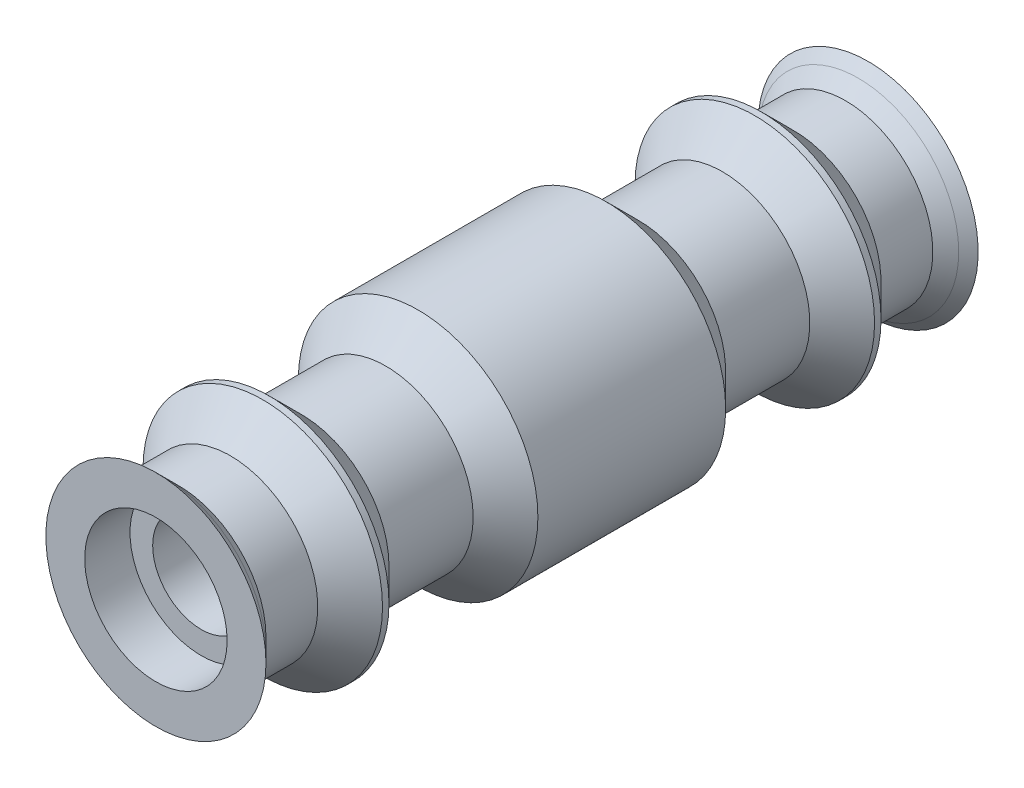
ISO-10303-21;
HEADER;
FILE_DESCRIPTION(('STEP AP214'),'2;1');
FILE_NAME('part.step','',(''),(''),'','','');
FILE_SCHEMA(('AUTOMOTIVE_DESIGN { 1 0 10303 214 1 1 1 1 }'));
ENDSEC;
DATA;
#1=APPLICATION_CONTEXT('core data for automotive mechanical design processes');
#2=APPLICATION_PROTOCOL_DEFINITION('international standard','automotive_design',2000,#1);
#3=PRODUCT_CONTEXT('',#1,'mechanical');
#4=PRODUCT('Part','Part','',(#3));
#5=PRODUCT_RELATED_PRODUCT_CATEGORY('part','',(#4));
#6=PRODUCT_DEFINITION_FORMATION('','',#4);
#7=PRODUCT_DEFINITION_CONTEXT('part definition',#1,'design');
#8=PRODUCT_DEFINITION('design','',#6,#7);
#9=PRODUCT_DEFINITION_SHAPE('','',#8);
#10=(LENGTH_UNIT() NAMED_UNIT(*) SI_UNIT(.MILLI.,.METRE.));
#11=(NAMED_UNIT(*) PLANE_ANGLE_UNIT() SI_UNIT($,.RADIAN.));
#12=(NAMED_UNIT(*) SI_UNIT($,.STERADIAN.) SOLID_ANGLE_UNIT());
#13=UNCERTAINTY_MEASURE_WITH_UNIT(LENGTH_MEASURE(1.E-05),#10,'distance_accuracy_value','');
#14=(GEOMETRIC_REPRESENTATION_CONTEXT(3) GLOBAL_UNCERTAINTY_ASSIGNED_CONTEXT((#13)) GLOBAL_UNIT_ASSIGNED_CONTEXT((#10,
#11,#12)) REPRESENTATION_CONTEXT('',''));
#15=CARTESIAN_POINT('',(0.,0.,0.));
#16=DIRECTION('',(0.,0.,1.));
#17=DIRECTION('',(1.,0.,0.));
#18=AXIS2_PLACEMENT_3D('',#15,#16,#17);
#19=CARTESIAN_POINT('',(0.,0.,107.));
#20=DIRECTION('',(0.,0.,-1.));
#21=DIRECTION('',(-1.,0.,0.));
#22=AXIS2_PLACEMENT_3D('',#19,#20,#21);
#23=CYLINDRICAL_SURFACE('',#22,18.5);
#24=CARTESIAN_POINT('',(0.,0.,90.9999999999999));
#25=DIRECTION('',(0.,0.,-1.));
#26=DIRECTION('',(-1.,0.,0.));
#27=AXIS2_PLACEMENT_3D('',#24,#25,#26);
#28=CIRCLE('',#27,18.5);
#29=CARTESIAN_POINT('',(-18.5,0.,91.));
#30=VERTEX_POINT('',#29);
#31=EDGE_CURVE('E51',#30,#30,#28,.F.);
#32=CARTESIAN_POINT('',(0.,0.,91.9999999999999));
#33=DIRECTION('',(0.,0.,-1.));
#34=DIRECTION('',(-1.,0.,0.));
#35=AXIS2_PLACEMENT_3D('',#32,#33,#34);
#36=CIRCLE('',#35,18.5);
#37=CARTESIAN_POINT('',(-18.5,0.,92.));
#38=VERTEX_POINT('',#37);
#39=EDGE_CURVE('E62',#38,#38,#36,.T.);
#40=CARTESIAN_POINT('',(-18.5,0.,91.));
#41=CARTESIAN_POINT('',(-18.5,0.,91.0104166666666));
#42=CARTESIAN_POINT('',(-18.5,0.,91.0208333333333));
#43=CARTESIAN_POINT('',(-18.5,0.,91.0416666666666));
#44=CARTESIAN_POINT('',(-18.5,0.,91.0520833333333));
#45=CARTESIAN_POINT('',(-18.5,0.,91.0729166666666));
#46=CARTESIAN_POINT('',(-18.5,0.,91.0833333333333));
#47=CARTESIAN_POINT('',(-18.5,0.,91.1041666666666));
#48=CARTESIAN_POINT('',(-18.5,0.,91.1145833333333));
#49=CARTESIAN_POINT('',(-18.5,0.,91.1354166666666));
#50=CARTESIAN_POINT('',(-18.5,0.,91.1458333333333));
#51=CARTESIAN_POINT('',(-18.5,0.,91.1666666666666));
#52=CARTESIAN_POINT('',(-18.5,0.,91.1770833333333));
#53=CARTESIAN_POINT('',(-18.5,0.,91.1979166666666));
#54=CARTESIAN_POINT('',(-18.5,0.,91.2083333333333));
#55=CARTESIAN_POINT('',(-18.5,0.,91.2291666666666));
#56=CARTESIAN_POINT('',(-18.5,0.,91.2395833333333));
#57=CARTESIAN_POINT('',(-18.5,0.,91.2604166666666));
#58=CARTESIAN_POINT('',(-18.5,0.,91.2708333333333));
#59=CARTESIAN_POINT('',(-18.5,0.,91.2916666666666));
#60=CARTESIAN_POINT('',(-18.5,0.,91.3020833333333));
#61=CARTESIAN_POINT('',(-18.5,0.,91.3229166666666));
#62=CARTESIAN_POINT('',(-18.5,0.,91.3333333333333));
#63=CARTESIAN_POINT('',(-18.5,0.,91.3541666666666));
#64=CARTESIAN_POINT('',(-18.5,0.,91.3645833333333));
#65=CARTESIAN_POINT('',(-18.5,0.,91.3854166666666));
#66=CARTESIAN_POINT('',(-18.5,0.,91.3958333333333));
#67=CARTESIAN_POINT('',(-18.5,0.,91.4166666666666));
#68=CARTESIAN_POINT('',(-18.5,0.,91.4270833333333));
#69=CARTESIAN_POINT('',(-18.5,0.,91.4479166666666));
#70=CARTESIAN_POINT('',(-18.5,0.,91.4583333333333));
#71=CARTESIAN_POINT('',(-18.5,0.,91.4791666666666));
#72=CARTESIAN_POINT('',(-18.5,0.,91.4895833333333));
#73=CARTESIAN_POINT('',(-18.5,0.,91.5104166666666));
#74=CARTESIAN_POINT('',(-18.5,0.,91.5208333333333));
#75=CARTESIAN_POINT('',(-18.5,0.,91.5416666666666));
#76=CARTESIAN_POINT('',(-18.5,0.,91.5520833333333));
#77=CARTESIAN_POINT('',(-18.5,0.,91.5729166666666));
#78=CARTESIAN_POINT('',(-18.5,0.,91.5833333333333));
#79=CARTESIAN_POINT('',(-18.5,0.,91.6041666666666));
#80=CARTESIAN_POINT('',(-18.5,0.,91.6145833333333));
#81=CARTESIAN_POINT('',(-18.5,0.,91.6354166666666));
#82=CARTESIAN_POINT('',(-18.5,0.,91.6458333333333));
#83=CARTESIAN_POINT('',(-18.5,0.,91.6666666666666));
#84=CARTESIAN_POINT('',(-18.5,0.,91.6770833333333));
#85=CARTESIAN_POINT('',(-18.5,0.,91.6979166666666));
#86=CARTESIAN_POINT('',(-18.5,0.,91.7083333333333));
#87=CARTESIAN_POINT('',(-18.5,0.,91.7291666666666));
#88=CARTESIAN_POINT('',(-18.5,0.,91.7395833333333));
#89=CARTESIAN_POINT('',(-18.5,0.,91.7604166666666));
#90=CARTESIAN_POINT('',(-18.5,0.,91.7708333333333));
#91=CARTESIAN_POINT('',(-18.5,0.,91.7916666666666));
#92=CARTESIAN_POINT('',(-18.5,0.,91.8020833333333));
#93=CARTESIAN_POINT('',(-18.5,0.,91.8229166666666));
#94=CARTESIAN_POINT('',(-18.5,0.,91.8333333333333));
#95=CARTESIAN_POINT('',(-18.5,0.,91.8541666666666));
#96=CARTESIAN_POINT('',(-18.5,0.,91.8645833333333));
#97=CARTESIAN_POINT('',(-18.5,0.,91.8854166666666));
#98=CARTESIAN_POINT('',(-18.5,0.,91.8958333333333));
#99=CARTESIAN_POINT('',(-18.5,0.,91.9166666666666));
#100=CARTESIAN_POINT('',(-18.5,0.,91.9270833333333));
#101=CARTESIAN_POINT('',(-18.5,0.,91.9479166666666));
#102=CARTESIAN_POINT('',(-18.5,0.,91.9583333333333));
#103=CARTESIAN_POINT('',(-18.5,0.,91.9791666666666));
#104=CARTESIAN_POINT('',(-18.5,0.,91.9895833333333));
#105=CARTESIAN_POINT('',(-18.5,0.,92.));
#106=B_SPLINE_CURVE_WITH_KNOTS('',3,(#40,#41,#42,#43,#44,#45,#46,#47,#48,#49,#50,#51,#52,#53,
#54,#55,#56,#57,#58,#59,#60,#61,#62,#63,#64,#65,#66,#67,#68,#69,#70,#71,#72,#73,#74,#75,#76,#77,
#78,#79,#80,#81,#82,#83,#84,#85,#86,#87,#88,#89,#90,#91,#92,#93,#94,#95,#96,#97,#98,#99,#100,
#101,#102,#103,#104,#105),.UNSPECIFIED.,.F.,.F.,(4,2,2,2,2,2,2,2,2,2,2,2,2,2,2,2,2,2,2,2,2,2,2,
2,2,2,2,2,2,2,2,2,4),(0.,0.0312499999999966,0.0624999999999931,0.0937499999999897,0.125,
0.156249999999997,0.187499999999993,0.218750000000004,0.25,0.281249999999997,0.312499999999993,
0.34374999999999,0.375,0.406249999999997,0.437499999999993,0.46874999999999,0.5,
0.531249999999997,0.562499999999994,0.59374999999999,0.625000000000001,0.656249999999997,
0.687499999999994,0.71874999999999,0.750000000000001,0.781249999999997,0.812499999999994,
0.84374999999999,0.875000000000001,0.906249999999997,0.937499999999994,0.96874999999999,1.),.UNSPECIFIED.);
#107=EDGE_CURVE('BSEAM35',#30,#38,#106,.T.);
#108=ORIENTED_EDGE('',*,*,#31,.T.);
#109=ORIENTED_EDGE('',*,*,#39,.T.);
#110=ORIENTED_EDGE('',*,*,#107,.T.);
#111=ORIENTED_EDGE('',*,*,#107,.F.);
#112=EDGE_LOOP('',(#108,#110,#109,#111));
#113=FACE_BOUND('',#112,.T.);
#114=ADVANCED_FACE('F35',(#113),#23,.T.);
#115=CARTESIAN_POINT('',(0.,0.,16.));
#116=DIRECTION('',(0.,0.,-1.));
#117=DIRECTION('',(-1.,0.,0.));
#118=AXIS2_PLACEMENT_3D('',#115,#116,#117);
#119=CIRCLE('',#118,18.5);
#120=CARTESIAN_POINT('',(-18.5,0.,16.));
#121=VERTEX_POINT('',#120);
#122=EDGE_CURVE('E47',#121,#121,#119,.T.);
#123=CARTESIAN_POINT('',(0.,0.,15.));
#124=DIRECTION('',(0.,0.,-1.));
#125=DIRECTION('',(-1.,0.,0.));
#126=AXIS2_PLACEMENT_3D('',#123,#124,#125);
#127=CIRCLE('',#126,18.5);
#128=CARTESIAN_POINT('',(-18.5,0.,15.));
#129=VERTEX_POINT('',#128);
#130=EDGE_CURVE('E68',#129,#129,#127,.F.);
#131=CARTESIAN_POINT('',(-18.5,0.,16.));
#132=CARTESIAN_POINT('',(-18.5,0.,15.9895833333333));
#133=CARTESIAN_POINT('',(-18.5,0.,15.9791666666666));
#134=CARTESIAN_POINT('',(-18.5,0.,15.9583333333333));
#135=CARTESIAN_POINT('',(-18.5,0.,15.9479166666666));
#136=CARTESIAN_POINT('',(-18.5,0.,15.9270833333333));
#137=CARTESIAN_POINT('',(-18.5,0.,15.9166666666666));
#138=CARTESIAN_POINT('',(-18.5,0.,15.8958333333333));
#139=CARTESIAN_POINT('',(-18.5,0.,15.8854166666666));
#140=CARTESIAN_POINT('',(-18.5,0.,15.8645833333333));
#141=CARTESIAN_POINT('',(-18.5,0.,15.8541666666666));
#142=CARTESIAN_POINT('',(-18.5,0.,15.8333333333333));
#143=CARTESIAN_POINT('',(-18.5,0.,15.8229166666666));
#144=CARTESIAN_POINT('',(-18.5,0.,15.8020833333333));
#145=CARTESIAN_POINT('',(-18.5,0.,15.7916666666666));
#146=CARTESIAN_POINT('',(-18.5,0.,15.7708333333333));
#147=CARTESIAN_POINT('',(-18.5,0.,15.7604166666666));
#148=CARTESIAN_POINT('',(-18.5,0.,15.7395833333333));
#149=CARTESIAN_POINT('',(-18.5,0.,15.7291666666666));
#150=CARTESIAN_POINT('',(-18.5,0.,15.7083333333333));
#151=CARTESIAN_POINT('',(-18.5,0.,15.6979166666666));
#152=CARTESIAN_POINT('',(-18.5,0.,15.6770833333333));
#153=CARTESIAN_POINT('',(-18.5,0.,15.6666666666666));
#154=CARTESIAN_POINT('',(-18.5,0.,15.6458333333333));
#155=CARTESIAN_POINT('',(-18.5,0.,15.6354166666667));
#156=CARTESIAN_POINT('',(-18.5,0.,15.6145833333333));
#157=CARTESIAN_POINT('',(-18.5,0.,15.6041666666667));
#158=CARTESIAN_POINT('',(-18.5,0.,15.5833333333333));
#159=CARTESIAN_POINT('',(-18.5,0.,15.5729166666667));
#160=CARTESIAN_POINT('',(-18.5,0.,15.5520833333333));
#161=CARTESIAN_POINT('',(-18.5,0.,15.5416666666666));
#162=CARTESIAN_POINT('',(-18.5,0.,15.5208333333333));
#163=CARTESIAN_POINT('',(-18.5,0.,15.5104166666667));
#164=CARTESIAN_POINT('',(-18.5,0.,15.4895833333333));
#165=CARTESIAN_POINT('',(-18.5,0.,15.4791666666667));
#166=CARTESIAN_POINT('',(-18.5,0.,15.4583333333333));
#167=CARTESIAN_POINT('',(-18.5,0.,15.4479166666667));
#168=CARTESIAN_POINT('',(-18.5,0.,15.4270833333333));
#169=CARTESIAN_POINT('',(-18.5,0.,15.4166666666667));
#170=CARTESIAN_POINT('',(-18.5,0.,15.3958333333333));
#171=CARTESIAN_POINT('',(-18.5,0.,15.3854166666667));
#172=CARTESIAN_POINT('',(-18.5,0.,15.3645833333333));
#173=CARTESIAN_POINT('',(-18.5,0.,15.3541666666667));
#174=CARTESIAN_POINT('',(-18.5,0.,15.3333333333333));
#175=CARTESIAN_POINT('',(-18.5,0.,15.3229166666667));
#176=CARTESIAN_POINT('',(-18.5,0.,15.3020833333333));
#177=CARTESIAN_POINT('',(-18.5,0.,15.2916666666667));
#178=CARTESIAN_POINT('',(-18.5,0.,15.2708333333333));
#179=CARTESIAN_POINT('',(-18.5,0.,15.2604166666667));
#180=CARTESIAN_POINT('',(-18.5,0.,15.2395833333333));
#181=CARTESIAN_POINT('',(-18.5,0.,15.2291666666667));
#182=CARTESIAN_POINT('',(-18.5,0.,15.2083333333333));
#183=CARTESIAN_POINT('',(-18.5,0.,15.1979166666667));
#184=CARTESIAN_POINT('',(-18.5,0.,15.1770833333333));
#185=CARTESIAN_POINT('',(-18.5,0.,15.1666666666667));
#186=CARTESIAN_POINT('',(-18.5,0.,15.1458333333333));
#187=CARTESIAN_POINT('',(-18.5,0.,15.1354166666667));
#188=CARTESIAN_POINT('',(-18.5,0.,15.1145833333333));
#189=CARTESIAN_POINT('',(-18.5,0.,15.1041666666667));
#190=CARTESIAN_POINT('',(-18.5,0.,15.0833333333333));
#191=CARTESIAN_POINT('',(-18.5,0.,15.0729166666667));
#192=CARTESIAN_POINT('',(-18.5,0.,15.0520833333333));
#193=CARTESIAN_POINT('',(-18.5,0.,15.0416666666667));
#194=CARTESIAN_POINT('',(-18.5,0.,15.0208333333333));
#195=CARTESIAN_POINT('',(-18.5,0.,15.0104166666667));
#196=CARTESIAN_POINT('',(-18.5,0.,15.));
#197=B_SPLINE_CURVE_WITH_KNOTS('',3,(#131,#132,#133,#134,#135,#136,#137,#138,#139,#140,#141,
#142,#143,#144,#145,#146,#147,#148,#149,#150,#151,#152,#153,#154,#155,#156,#157,#158,#159,#160,
#161,#162,#163,#164,#165,#166,#167,#168,#169,#170,#171,#172,#173,#174,#175,#176,#177,#178,#179,
#180,#181,#182,#183,#184,#185,#186,#187,#188,#189,#190,#191,#192,#193,#194,#195,#196),
.UNSPECIFIED.,.F.,.F.,(4,2,2,2,2,2,2,2,2,2,2,2,2,2,2,2,2,2,2,2,2,2,2,2,2,2,2,2,2,2,2,2,4),(0.,
0.0312499999999966,0.0624999999999931,0.0937500000000036,0.125,0.156249999999997,
0.187499999999993,0.21874999999999,0.25,0.281249999999997,0.312499999999993,0.34374999999999,
0.374999999999986,0.406249999999983,0.437499999999993,0.46874999999999,0.499999999999987,
0.531249999999983,0.56249999999998,0.59374999999999,0.624999999999987,0.656249999999983,
0.68749999999998,0.718749999999976,0.749999999999973,0.781249999999983,0.81249999999998,
0.843749999999976,0.874999999999973,0.90624999999997,0.93749999999998,0.968749999999977,
0.999999999999973),.UNSPECIFIED.);
#198=EDGE_CURVE('BSEAM132',#121,#129,#197,.T.);
#199=ORIENTED_EDGE('',*,*,#122,.T.);
#200=ORIENTED_EDGE('',*,*,#130,.T.);
#201=ORIENTED_EDGE('',*,*,#198,.T.);
#202=ORIENTED_EDGE('',*,*,#198,.F.);
#203=EDGE_LOOP('',(#199,#201,#200,#202));
#204=FACE_BOUND('',#203,.T.);
#205=ADVANCED_FACE('F132',(#204),#23,.T.);
#206=CARTESIAN_POINT('',(0.,0.,39.));
#207=DIRECTION('',(0.,0.,-1.));
#208=DIRECTION('',(-1.,0.,0.));
#209=AXIS2_PLACEMENT_3D('',#206,#207,#208);
#210=CIRCLE('',#209,18.5);
#211=CARTESIAN_POINT('',(-18.5,0.,39.));
#212=VERTEX_POINT('',#211);
#213=EDGE_CURVE('E56',#212,#212,#210,.F.);
#214=CARTESIAN_POINT('',(0.,0.,67.9999999999999));
#215=DIRECTION('',(0.,0.,-1.));
#216=DIRECTION('',(-1.,0.,0.));
#217=AXIS2_PLACEMENT_3D('',#214,#215,#216);
#218=CIRCLE('',#217,18.5);
#219=CARTESIAN_POINT('',(-18.5,0.,67.9999999999999));
#220=VERTEX_POINT('',#219);
#221=EDGE_CURVE('E59',#220,#220,#218,.T.);
#222=CARTESIAN_POINT('',(-18.5,0.,39.));
#223=CARTESIAN_POINT('',(-18.5,0.,39.3020833333333));
#224=CARTESIAN_POINT('',(-18.5,0.,39.6041666666667));
#225=CARTESIAN_POINT('',(-18.5,0.,40.2083333333333));
#226=CARTESIAN_POINT('',(-18.5,0.,40.5104166666667));
#227=CARTESIAN_POINT('',(-18.5,0.,41.1145833333333));
#228=CARTESIAN_POINT('',(-18.5,0.,41.4166666666667));
#229=CARTESIAN_POINT('',(-18.5,0.,42.0208333333333));
#230=CARTESIAN_POINT('',(-18.5,0.,42.3229166666667));
#231=CARTESIAN_POINT('',(-18.5,0.,42.9270833333333));
#232=CARTESIAN_POINT('',(-18.5,0.,43.2291666666666));
#233=CARTESIAN_POINT('',(-18.5,0.,43.8333333333333));
#234=CARTESIAN_POINT('',(-18.5,0.,44.1354166666667));
#235=CARTESIAN_POINT('',(-18.5,0.,44.7395833333333));
#236=CARTESIAN_POINT('',(-18.5,0.,45.0416666666666));
#237=CARTESIAN_POINT('',(-18.5,0.,45.6458333333333));
#238=CARTESIAN_POINT('',(-18.5,0.,45.9479166666666));
#239=CARTESIAN_POINT('',(-18.5,0.,46.5520833333333));
#240=CARTESIAN_POINT('',(-18.5,0.,46.8541666666666));
#241=CARTESIAN_POINT('',(-18.5,0.,47.4583333333333));
#242=CARTESIAN_POINT('',(-18.5,0.,47.7604166666666));
#243=CARTESIAN_POINT('',(-18.5,0.,48.3645833333333));
#244=CARTESIAN_POINT('',(-18.5,0.,48.6666666666666));
#245=CARTESIAN_POINT('',(-18.5,0.,49.2708333333333));
#246=CARTESIAN_POINT('',(-18.5,0.,49.5729166666666));
#247=CARTESIAN_POINT('',(-18.5,0.,50.1770833333333));
#248=CARTESIAN_POINT('',(-18.5,0.,50.4791666666666));
#249=CARTESIAN_POINT('',(-18.5,0.,51.0833333333333));
#250=CARTESIAN_POINT('',(-18.5,0.,51.3854166666666));
#251=CARTESIAN_POINT('',(-18.5,0.,51.9895833333333));
#252=CARTESIAN_POINT('',(-18.5,0.,52.2916666666666));
#253=CARTESIAN_POINT('',(-18.5,0.,52.8958333333333));
#254=CARTESIAN_POINT('',(-18.5,0.,53.1979166666666));
#255=CARTESIAN_POINT('',(-18.5,0.,53.8020833333333));
#256=CARTESIAN_POINT('',(-18.5,0.,54.1041666666666));
#257=CARTESIAN_POINT('',(-18.5,0.,54.7083333333333));
#258=CARTESIAN_POINT('',(-18.5,0.,55.0104166666666));
#259=CARTESIAN_POINT('',(-18.5,0.,55.6145833333333));
#260=CARTESIAN_POINT('',(-18.5,0.,55.9166666666666));
#261=CARTESIAN_POINT('',(-18.5,0.,56.5208333333333));
#262=CARTESIAN_POINT('',(-18.5,0.,56.8229166666666));
#263=CARTESIAN_POINT('',(-18.5,0.,57.4270833333333));
#264=CARTESIAN_POINT('',(-18.5,0.,57.7291666666666));
#265=CARTESIAN_POINT('',(-18.5,0.,58.3333333333333));
#266=CARTESIAN_POINT('',(-18.5,0.,58.6354166666666));
#267=CARTESIAN_POINT('',(-18.5,0.,59.2395833333333));
#268=CARTESIAN_POINT('',(-18.5,0.,59.5416666666666));
#269=CARTESIAN_POINT('',(-18.5,0.,60.1458333333333));
#270=CARTESIAN_POINT('',(-18.5,0.,60.4479166666666));
#271=CARTESIAN_POINT('',(-18.5,0.,61.0520833333333));
#272=CARTESIAN_POINT('',(-18.5,0.,61.3541666666666));
#273=CARTESIAN_POINT('',(-18.5,0.,61.9583333333333));
#274=CARTESIAN_POINT('',(-18.5,0.,62.2604166666666));
#275=CARTESIAN_POINT('',(-18.5,0.,62.8645833333333));
#276=CARTESIAN_POINT('',(-18.5,0.,63.1666666666666));
#277=CARTESIAN_POINT('',(-18.5,0.,63.7708333333333));
#278=CARTESIAN_POINT('',(-18.5,0.,64.0729166666666));
#279=CARTESIAN_POINT('',(-18.5,0.,64.6770833333333));
#280=CARTESIAN_POINT('',(-18.5,0.,64.9791666666666));
#281=CARTESIAN_POINT('',(-18.5,0.,65.5833333333333));
#282=CARTESIAN_POINT('',(-18.5,0.,65.8854166666666));
#283=CARTESIAN_POINT('',(-18.5,0.,66.4895833333333));
#284=CARTESIAN_POINT('',(-18.5,0.,66.7916666666666));
#285=CARTESIAN_POINT('',(-18.5,0.,67.3958333333333));
#286=CARTESIAN_POINT('',(-18.5,0.,67.6979166666666));
#287=CARTESIAN_POINT('',(-18.5,0.,67.9999999999999));
#288=B_SPLINE_CURVE_WITH_KNOTS('',3,(#222,#223,#224,#225,#226,#227,#228,#229,#230,#231,#232,
#233,#234,#235,#236,#237,#238,#239,#240,#241,#242,#243,#244,#245,#246,#247,#248,#249,#250,#251,
#252,#253,#254,#255,#256,#257,#258,#259,#260,#261,#262,#263,#264,#265,#266,#267,#268,#269,#270,
#271,#272,#273,#274,#275,#276,#277,#278,#279,#280,#281,#282,#283,#284,#285,#286,#287),
.UNSPECIFIED.,.F.,.F.,(4,2,2,2,2,2,2,2,2,2,2,2,2,2,2,2,2,2,2,2,2,2,2,2,2,2,2,2,2,2,2,2,4),(0.,
0.906249999999997,1.81249999999999,2.71874999999999,3.62499999999999,4.53124999999999,5.4375,
6.34374999999998,7.24999999999999,8.15624999999998,9.06249999999998,9.96874999999998,10.875,
11.78125,12.6875,13.59375,14.5,15.40625,16.3125,17.21875,18.125,19.03125,19.9375,20.84375,21.75,
22.65625,23.5625,24.46875,25.375,26.28125,27.1875,28.09375,29.),.UNSPECIFIED.);
#289=EDGE_CURVE('BSEAM135',#212,#220,#288,.T.);
#290=ORIENTED_EDGE('',*,*,#213,.T.);
#291=ORIENTED_EDGE('',*,*,#221,.T.);
#292=ORIENTED_EDGE('',*,*,#289,.T.);
#293=ORIENTED_EDGE('',*,*,#289,.F.);
#294=EDGE_LOOP('',(#290,#292,#291,#293));
#295=FACE_BOUND('',#294,.T.);
#296=ADVANCED_FACE('F135',(#295),#23,.T.);
#297=CARTESIAN_POINT('',(0.,0.,5.5));
#298=DIRECTION('',(0.,0.,-1.));
#299=DIRECTION('',(-1.,0.,0.));
#300=AXIS2_PLACEMENT_3D('',#297,#298,#299);
#301=CYLINDRICAL_SURFACE('',#300,11.);
#302=CARTESIAN_POINT('',(0.,0.,5.5));
#303=DIRECTION('',(0.,0.,-1.));
#304=DIRECTION('',(-1.,0.,0.));
#305=AXIS2_PLACEMENT_3D('',#302,#303,#304);
#306=CIRCLE('',#305,11.);
#307=CARTESIAN_POINT('',(-11.,0.,5.5));
#308=VERTEX_POINT('',#307);
#309=EDGE_CURVE('E74',#308,#308,#306,.T.);
#310=ORIENTED_EDGE('',*,*,#309,.F.);
#311=EDGE_LOOP('',(#310));
#312=FACE_BOUND('',#311,.T.);
#313=CARTESIAN_POINT('',(0.,0.,-1.5));
#314=DIRECTION('',(0.,0.,-1.));
#315=DIRECTION('',(-1.,0.,0.));
#316=AXIS2_PLACEMENT_3D('',#313,#314,#315);
#317=CIRCLE('',#316,11.);
#318=CARTESIAN_POINT('',(-11.,0.,-1.5));
#319=VERTEX_POINT('',#318);
#320=EDGE_CURVE('E108',#319,#319,#317,.F.);
#321=ORIENTED_EDGE('',*,*,#320,.F.);
#322=EDGE_LOOP('',(#321));
#323=FACE_BOUND('',#322,.T.);
#324=ADVANCED_FACE('F144',(#312,#323),#301,.F.);
#325=CARTESIAN_POINT('',(0.,0.,5.5));
#326=DIRECTION('',(0.,0.,-1.));
#327=DIRECTION('',(-1.,0.,0.));
#328=AXIS2_PLACEMENT_3D('',#325,#326,#327);
#329=PLANE('',#328);
#330=CARTESIAN_POINT('',(0.,0.,5.5));
#331=DIRECTION('',(0.,0.,-1.));
#332=DIRECTION('',(-1.,0.,0.));
#333=AXIS2_PLACEMENT_3D('',#330,#331,#332);
#334=CIRCLE('',#333,7.5);
#335=CARTESIAN_POINT('',(-7.5,0.,5.5));
#336=VERTEX_POINT('',#335);
#337=EDGE_CURVE('E79',#336,#336,#334,.T.);
#338=ORIENTED_EDGE('',*,*,#337,.F.);
#339=EDGE_LOOP('',(#338));
#340=FACE_BOUND('',#339,.T.);
#341=ORIENTED_EDGE('',*,*,#309,.T.);
#342=EDGE_LOOP('',(#341));
#343=FACE_BOUND('',#342,.T.);
#344=ADVANCED_FACE('F149',(#340,#343),#329,.T.);
#345=CARTESIAN_POINT('',(0.,0.,101.5));
#346=DIRECTION('',(0.,0.,1.));
#347=DIRECTION('',(1.,0.,0.));
#348=AXIS2_PLACEMENT_3D('',#345,#346,#347);
#349=CYLINDRICAL_SURFACE('',#348,11.);
#350=CARTESIAN_POINT('',(0.,0.,101.5));
#351=DIRECTION('',(0.,0.,1.));
#352=DIRECTION('',(1.,0.,0.));
#353=AXIS2_PLACEMENT_3D('',#350,#351,#352);
#354=CIRCLE('',#353,11.);
#355=CARTESIAN_POINT('',(11.,0.,101.5));
#356=VERTEX_POINT('',#355);
#357=EDGE_CURVE('E78',#356,#356,#354,.T.);
#358=ORIENTED_EDGE('',*,*,#357,.F.);
#359=EDGE_LOOP('',(#358));
#360=FACE_BOUND('',#359,.T.);
#361=CARTESIAN_POINT('',(0.,0.,108.5));
#362=DIRECTION('',(0.,0.,1.));
#363=DIRECTION('',(1.,0.,0.));
#364=AXIS2_PLACEMENT_3D('',#361,#362,#363);
#365=CIRCLE('',#364,11.);
#366=CARTESIAN_POINT('',(11.,0.,108.5));
#367=VERTEX_POINT('',#366);
#368=EDGE_CURVE('E113',#367,#367,#365,.T.);
#369=ORIENTED_EDGE('',*,*,#368,.T.);
#370=EDGE_LOOP('',(#369));
#371=FACE_BOUND('',#370,.T.);
#372=ADVANCED_FACE('F117',(#360,#371),#349,.F.);
#373=CARTESIAN_POINT('',(0.,0.,101.5));
#374=DIRECTION('',(0.,0.,1.));
#375=DIRECTION('',(1.,0.,0.));
#376=AXIS2_PLACEMENT_3D('',#373,#374,#375);
#377=PLANE('',#376);
#378=CARTESIAN_POINT('',(0.,0.,101.5));
#379=DIRECTION('',(0.,0.,1.));
#380=DIRECTION('',(1.,0.,0.));
#381=AXIS2_PLACEMENT_3D('',#378,#379,#380);
#382=CIRCLE('',#381,7.5);
#383=CARTESIAN_POINT('',(7.5,0.,101.5));
#384=VERTEX_POINT('',#383);
#385=EDGE_CURVE('E75',#384,#384,#382,.T.);
#386=ORIENTED_EDGE('',*,*,#385,.F.);
#387=EDGE_LOOP('',(#386));
#388=FACE_BOUND('',#387,.T.);
#389=ORIENTED_EDGE('',*,*,#357,.T.);
#390=EDGE_LOOP('',(#389));
#391=FACE_BOUND('',#390,.T.);
#392=ADVANCED_FACE('F245',(#388,#391),#377,.T.);
#393=CARTESIAN_POINT('',(0.,0.,109.5));
#394=DIRECTION('',(0.,0.,-1.));
#395=DIRECTION('',(-1.,0.,0.));
#396=AXIS2_PLACEMENT_3D('',#393,#394,#395);
#397=CYLINDRICAL_SURFACE('',#396,7.5);
#398=ORIENTED_EDGE('',*,*,#385,.T.);
#399=EDGE_LOOP('',(#398));
#400=FACE_BOUND('',#399,.T.);
#401=ORIENTED_EDGE('',*,*,#337,.T.);
#402=EDGE_LOOP('',(#401));
#403=FACE_BOUND('',#402,.T.);
#404=ADVANCED_FACE('F353',(#400,#403),#397,.F.);
#405=CARTESIAN_POINT('',(0.,0.,97.));
#406=DIRECTION('',(0.,0.,1.));
#407=DIRECTION('',(1.,0.,0.));
#408=AXIS2_PLACEMENT_3D('',#405,#406,#407);
#409=CYLINDRICAL_SURFACE('',#408,13.5);
#410=CARTESIAN_POINT('',(0.,0.,97.));
#411=DIRECTION('',(0.,0.,-1.));
#412=DIRECTION('',(-1.,0.,0.));
#413=AXIS2_PLACEMENT_3D('',#410,#411,#412);
#414=CIRCLE('',#413,13.5);
#415=CARTESIAN_POINT('',(-13.5,0.,97.));
#416=VERTEX_POINT('',#415);
#417=EDGE_CURVE('E86',#416,#416,#414,.T.);
#418=ORIENTED_EDGE('',*,*,#417,.F.);
#419=EDGE_LOOP('',(#418));
#420=FACE_BOUND('',#419,.T.);
#421=CARTESIAN_POINT('',(0.,0.,105.));
#422=DIRECTION('',(0.,0.,-1.));
#423=DIRECTION('',(-1.,0.,0.));
#424=AXIS2_PLACEMENT_3D('',#421,#422,#423);
#425=CIRCLE('',#424,13.5);
#426=CARTESIAN_POINT('',(-13.5,0.,105.));
#427=VERTEX_POINT('',#426);
#428=EDGE_CURVE('E87',#427,#427,#425,.T.);
#429=ORIENTED_EDGE('',*,*,#428,.T.);
#430=EDGE_LOOP('',(#429));
#431=FACE_BOUND('',#430,.T.);
#432=ADVANCED_FACE('F344',(#420,#431),#409,.T.);
#433=CARTESIAN_POINT('',(0.,0.,34.));
#434=DIRECTION('',(0.,0.,-1.));
#435=DIRECTION('',(-1.,0.,0.));
#436=AXIS2_PLACEMENT_3D('',#433,#434,#435);
#437=CYLINDRICAL_SURFACE('',#436,13.5);
#438=CARTESIAN_POINT('',(0.,0.,34.));
#439=DIRECTION('',(0.,0.,-1.));
#440=DIRECTION('',(-1.,0.,0.));
#441=AXIS2_PLACEMENT_3D('',#438,#439,#440);
#442=CIRCLE('',#441,13.5);
#443=CARTESIAN_POINT('',(-13.5,0.,34.));
#444=VERTEX_POINT('',#443);
#445=EDGE_CURVE('E90',#444,#444,#442,.T.);
#446=CARTESIAN_POINT('',(0.,0.,21.));
#447=DIRECTION('',(0.,0.,-1.));
#448=DIRECTION('',(-1.,0.,0.));
#449=AXIS2_PLACEMENT_3D('',#446,#447,#448);
#450=CIRCLE('',#449,13.5);
#451=CARTESIAN_POINT('',(-13.5,0.,21.));
#452=VERTEX_POINT('',#451);
#453=EDGE_CURVE('E93',#452,#452,#450,.T.);
#454=CARTESIAN_POINT('',(-13.5,0.,34.));
#455=CARTESIAN_POINT('',(-13.5,0.,33.8645833333333));
#456=CARTESIAN_POINT('',(-13.5,0.,33.7291666666667));
#457=CARTESIAN_POINT('',(-13.5,0.,33.4583333333333));
#458=CARTESIAN_POINT('',(-13.5,0.,33.3229166666667));
#459=CARTESIAN_POINT('',(-13.5,0.,33.0520833333333));
#460=CARTESIAN_POINT('',(-13.5,0.,32.9166666666667));
#461=CARTESIAN_POINT('',(-13.5,0.,32.6458333333333));
#462=CARTESIAN_POINT('',(-13.5,0.,32.5104166666667));
#463=CARTESIAN_POINT('',(-13.5,0.,32.2395833333333));
#464=CARTESIAN_POINT('',(-13.5,0.,32.1041666666667));
#465=CARTESIAN_POINT('',(-13.5,0.,31.8333333333333));
#466=CARTESIAN_POINT('',(-13.5,0.,31.6979166666667));
#467=CARTESIAN_POINT('',(-13.5,0.,31.4270833333333));
#468=CARTESIAN_POINT('',(-13.5,0.,31.2916666666667));
#469=CARTESIAN_POINT('',(-13.5,0.,31.0208333333333));
#470=CARTESIAN_POINT('',(-13.5,0.,30.8854166666667));
#471=CARTESIAN_POINT('',(-13.5,0.,30.6145833333333));
#472=CARTESIAN_POINT('',(-13.5,0.,30.4791666666667));
#473=CARTESIAN_POINT('',(-13.5,0.,30.2083333333333));
#474=CARTESIAN_POINT('',(-13.5,0.,30.0729166666667));
#475=CARTESIAN_POINT('',(-13.5,0.,29.8020833333333));
#476=CARTESIAN_POINT('',(-13.5,0.,29.6666666666667));
#477=CARTESIAN_POINT('',(-13.5,0.,29.3958333333333));
#478=CARTESIAN_POINT('',(-13.5,0.,29.2604166666667));
#479=CARTESIAN_POINT('',(-13.5,0.,28.9895833333333));
#480=CARTESIAN_POINT('',(-13.5,0.,28.8541666666667));
#481=CARTESIAN_POINT('',(-13.5,0.,28.5833333333333));
#482=CARTESIAN_POINT('',(-13.5,0.,28.4479166666667));
#483=CARTESIAN_POINT('',(-13.5,0.,28.1770833333333));
#484=CARTESIAN_POINT('',(-13.5,0.,28.0416666666667));
#485=CARTESIAN_POINT('',(-13.5,0.,27.7708333333333));
#486=CARTESIAN_POINT('',(-13.5,0.,27.6354166666667));
#487=CARTESIAN_POINT('',(-13.5,0.,27.3645833333333));
#488=CARTESIAN_POINT('',(-13.5,0.,27.2291666666667));
#489=CARTESIAN_POINT('',(-13.5,0.,26.9583333333333));
#490=CARTESIAN_POINT('',(-13.5,0.,26.8229166666667));
#491=CARTESIAN_POINT('',(-13.5,0.,26.5520833333333));
#492=CARTESIAN_POINT('',(-13.5,0.,26.4166666666667));
#493=CARTESIAN_POINT('',(-13.5,0.,26.1458333333333));
#494=CARTESIAN_POINT('',(-13.5,0.,26.0104166666667));
#495=CARTESIAN_POINT('',(-13.5,0.,25.7395833333333));
#496=CARTESIAN_POINT('',(-13.5,0.,25.6041666666667));
#497=CARTESIAN_POINT('',(-13.5,0.,25.3333333333333));
#498=CARTESIAN_POINT('',(-13.5,0.,25.1979166666667));
#499=CARTESIAN_POINT('',(-13.5,0.,24.9270833333333));
#500=CARTESIAN_POINT('',(-13.5,0.,24.7916666666667));
#501=CARTESIAN_POINT('',(-13.5,0.,24.5208333333333));
#502=CARTESIAN_POINT('',(-13.5,0.,24.3854166666667));
#503=CARTESIAN_POINT('',(-13.5,0.,24.1145833333333));
#504=CARTESIAN_POINT('',(-13.5,0.,23.9791666666667));
#505=CARTESIAN_POINT('',(-13.5,0.,23.7083333333333));
#506=CARTESIAN_POINT('',(-13.5,0.,23.5729166666667));
#507=CARTESIAN_POINT('',(-13.5,0.,23.3020833333333));
#508=CARTESIAN_POINT('',(-13.5,0.,23.1666666666667));
#509=CARTESIAN_POINT('',(-13.5,0.,22.8958333333333));
#510=CARTESIAN_POINT('',(-13.5,0.,22.7604166666667));
#511=CARTESIAN_POINT('',(-13.5,0.,22.4895833333333));
#512=CARTESIAN_POINT('',(-13.5,0.,22.3541666666667));
#513=CARTESIAN_POINT('',(-13.5,0.,22.0833333333333));
#514=CARTESIAN_POINT('',(-13.5,0.,21.9479166666667));
#515=CARTESIAN_POINT('',(-13.5,0.,21.6770833333333));
#516=CARTESIAN_POINT('',(-13.5,0.,21.5416666666667));
#517=CARTESIAN_POINT('',(-13.5,0.,21.2708333333333));
#518=CARTESIAN_POINT('',(-13.5,0.,21.1354166666667));
#519=CARTESIAN_POINT('',(-13.5,0.,21.));
#520=B_SPLINE_CURVE_WITH_KNOTS('',3,(#454,#455,#456,#457,#458,#459,#460,#461,#462,#463,#464,
#465,#466,#467,#468,#469,#470,#471,#472,#473,#474,#475,#476,#477,#478,#479,#480,#481,#482,#483,
#484,#485,#486,#487,#488,#489,#490,#491,#492,#493,#494,#495,#496,#497,#498,#499,#500,#501,#502,
#503,#504,#505,#506,#507,#508,#509,#510,#511,#512,#513,#514,#515,#516,#517,#518,#519),
.UNSPECIFIED.,.F.,.F.,(4,2,2,2,2,2,2,2,2,2,2,2,2,2,2,2,2,2,2,2,2,2,2,2,2,2,2,2,2,2,2,2,4),(0.,
0.406249999999997,0.812499999999994,1.21875,1.62499999999999,2.03125,2.4375,2.84375,3.25,
3.65625,4.0625,4.46875,4.875,5.28124999999999,5.6875,6.09374999999999,6.5,6.90625,7.3125,
7.71875,8.12499999999999,8.53125,8.93749999999999,9.34375,9.74999999999999,10.15625,10.5625,
10.96875,11.375,11.78125,12.1875,12.59375,13.),.UNSPECIFIED.);
#521=EDGE_CURVE('BSEAM209',#444,#452,#520,.T.);
#522=ORIENTED_EDGE('',*,*,#445,.T.);
#523=ORIENTED_EDGE('',*,*,#453,.F.);
#524=ORIENTED_EDGE('',*,*,#521,.T.);
#525=ORIENTED_EDGE('',*,*,#521,.F.);
#526=EDGE_LOOP('',(#522,#524,#523,#525));
#527=FACE_BOUND('',#526,.T.);
#528=ADVANCED_FACE('F209',(#527),#437,.T.);
#529=CARTESIAN_POINT('',(0.,0.,10.));
#530=DIRECTION('',(0.,0.,-1.));
#531=DIRECTION('',(-1.,0.,0.));
#532=AXIS2_PLACEMENT_3D('',#529,#530,#531);
#533=CYLINDRICAL_SURFACE('',#532,13.5);
#534=CARTESIAN_POINT('',(0.,0.,10.));
#535=DIRECTION('',(0.,0.,-1.));
#536=DIRECTION('',(-1.,0.,0.));
#537=AXIS2_PLACEMENT_3D('',#534,#535,#536);
#538=CIRCLE('',#537,13.5);
#539=CARTESIAN_POINT('',(-13.5,0.,10.));
#540=VERTEX_POINT('',#539);
#541=EDGE_CURVE('E96',#540,#540,#538,.T.);
#542=ORIENTED_EDGE('',*,*,#541,.T.);
#543=EDGE_LOOP('',(#542));
#544=FACE_BOUND('',#543,.T.);
#545=CARTESIAN_POINT('',(0.,0.,2.));
#546=DIRECTION('',(0.,0.,-1.));
#547=DIRECTION('',(-1.,0.,0.));
#548=AXIS2_PLACEMENT_3D('',#545,#546,#547);
#549=CIRCLE('',#548,13.5);
#550=CARTESIAN_POINT('',(-13.5,0.,2.));
#551=VERTEX_POINT('',#550);
#552=EDGE_CURVE('E99',#551,#551,#549,.T.);
#553=ORIENTED_EDGE('',*,*,#552,.F.);
#554=EDGE_LOOP('',(#553));
#555=FACE_BOUND('',#554,.T.);
#556=ADVANCED_FACE('F205',(#544,#555),#533,.T.);
#557=CARTESIAN_POINT('',(0.,0.,73.));
#558=DIRECTION('',(0.,0.,1.));
#559=DIRECTION('',(1.,0.,0.));
#560=AXIS2_PLACEMENT_3D('',#557,#558,#559);
#561=CYLINDRICAL_SURFACE('',#560,13.5);
#562=CARTESIAN_POINT('',(0.,0.,73.));
#563=DIRECTION('',(0.,0.,-1.));
#564=DIRECTION('',(-1.,0.,0.));
#565=AXIS2_PLACEMENT_3D('',#562,#563,#564);
#566=CIRCLE('',#565,13.5);
#567=CARTESIAN_POINT('',(13.5,0.,73.));
#568=VERTEX_POINT('',#567);
#569=EDGE_CURVE('E102',#568,#568,#566,.T.);
#570=CARTESIAN_POINT('',(0.,0.,86.));
#571=DIRECTION('',(0.,0.,-1.));
#572=DIRECTION('',(-1.,0.,0.));
#573=AXIS2_PLACEMENT_3D('',#570,#571,#572);
#574=CIRCLE('',#573,13.5);
#575=CARTESIAN_POINT('',(13.5,0.,86.));
#576=VERTEX_POINT('',#575);
#577=EDGE_CURVE('E105',#576,#576,#574,.T.);
#578=CARTESIAN_POINT('',(13.5,0.,73.));
#579=CARTESIAN_POINT('',(13.5,0.,73.1354166666667));
#580=CARTESIAN_POINT('',(13.5,0.,73.2708333333333));
#581=CARTESIAN_POINT('',(13.5,0.,73.5416666666667));
#582=CARTESIAN_POINT('',(13.5,0.,73.6770833333333));
#583=CARTESIAN_POINT('',(13.5,0.,73.9479166666667));
#584=CARTESIAN_POINT('',(13.5,0.,74.0833333333333));
#585=CARTESIAN_POINT('',(13.5,0.,74.3541666666667));
#586=CARTESIAN_POINT('',(13.5,0.,74.4895833333333));
#587=CARTESIAN_POINT('',(13.5,0.,74.7604166666667));
#588=CARTESIAN_POINT('',(13.5,0.,74.8958333333333));
#589=CARTESIAN_POINT('',(13.5,0.,75.1666666666667));
#590=CARTESIAN_POINT('',(13.5,0.,75.3020833333333));
#591=CARTESIAN_POINT('',(13.5,0.,75.5729166666667));
#592=CARTESIAN_POINT('',(13.5,0.,75.7083333333333));
#593=CARTESIAN_POINT('',(13.5,0.,75.9791666666667));
#594=CARTESIAN_POINT('',(13.5,0.,76.1145833333333));
#595=CARTESIAN_POINT('',(13.5,0.,76.3854166666667));
#596=CARTESIAN_POINT('',(13.5,0.,76.5208333333333));
#597=CARTESIAN_POINT('',(13.5,0.,76.7916666666667));
#598=CARTESIAN_POINT('',(13.5,0.,76.9270833333333));
#599=CARTESIAN_POINT('',(13.5,0.,77.1979166666667));
#600=CARTESIAN_POINT('',(13.5,0.,77.3333333333333));
#601=CARTESIAN_POINT('',(13.5,0.,77.6041666666667));
#602=CARTESIAN_POINT('',(13.5,0.,77.7395833333333));
#603=CARTESIAN_POINT('',(13.5,0.,78.0104166666667));
#604=CARTESIAN_POINT('',(13.5,0.,78.1458333333333));
#605=CARTESIAN_POINT('',(13.5,0.,78.4166666666667));
#606=CARTESIAN_POINT('',(13.5,0.,78.5520833333333));
#607=CARTESIAN_POINT('',(13.5,0.,78.8229166666667));
#608=CARTESIAN_POINT('',(13.5,0.,78.9583333333333));
#609=CARTESIAN_POINT('',(13.5,0.,79.2291666666667));
#610=CARTESIAN_POINT('',(13.5,0.,79.3645833333333));
#611=CARTESIAN_POINT('',(13.5,0.,79.6354166666667));
#612=CARTESIAN_POINT('',(13.5,0.,79.7708333333333));
#613=CARTESIAN_POINT('',(13.5,0.,80.0416666666667));
#614=CARTESIAN_POINT('',(13.5,0.,80.1770833333333));
#615=CARTESIAN_POINT('',(13.5,0.,80.4479166666667));
#616=CARTESIAN_POINT('',(13.5,0.,80.5833333333333));
#617=CARTESIAN_POINT('',(13.5,0.,80.8541666666667));
#618=CARTESIAN_POINT('',(13.5,0.,80.9895833333333));
#619=CARTESIAN_POINT('',(13.5,0.,81.2604166666667));
#620=CARTESIAN_POINT('',(13.5,0.,81.3958333333333));
#621=CARTESIAN_POINT('',(13.5,0.,81.6666666666667));
#622=CARTESIAN_POINT('',(13.5,0.,81.8020833333333));
#623=CARTESIAN_POINT('',(13.5,0.,82.0729166666667));
#624=CARTESIAN_POINT('',(13.5,0.,82.2083333333333));
#625=CARTESIAN_POINT('',(13.5,0.,82.4791666666667));
#626=CARTESIAN_POINT('',(13.5,0.,82.6145833333333));
#627=CARTESIAN_POINT('',(13.5,0.,82.8854166666667));
#628=CARTESIAN_POINT('',(13.5,0.,83.0208333333333));
#629=CARTESIAN_POINT('',(13.5,0.,83.2916666666667));
#630=CARTESIAN_POINT('',(13.5,0.,83.4270833333333));
#631=CARTESIAN_POINT('',(13.5,0.,83.6979166666667));
#632=CARTESIAN_POINT('',(13.5,0.,83.8333333333333));
#633=CARTESIAN_POINT('',(13.5,0.,84.1041666666667));
#634=CARTESIAN_POINT('',(13.5,0.,84.2395833333333));
#635=CARTESIAN_POINT('',(13.5,0.,84.5104166666667));
#636=CARTESIAN_POINT('',(13.5,0.,84.6458333333333));
#637=CARTESIAN_POINT('',(13.5,0.,84.9166666666667));
#638=CARTESIAN_POINT('',(13.5,0.,85.0520833333333));
#639=CARTESIAN_POINT('',(13.5,0.,85.3229166666667));
#640=CARTESIAN_POINT('',(13.5,0.,85.4583333333333));
#641=CARTESIAN_POINT('',(13.5,0.,85.7291666666667));
#642=CARTESIAN_POINT('',(13.5,0.,85.8645833333333));
#643=CARTESIAN_POINT('',(13.5,0.,86.));
#644=B_SPLINE_CURVE_WITH_KNOTS('',3,(#578,#579,#580,#581,#582,#583,#584,#585,#586,#587,#588,
#589,#590,#591,#592,#593,#594,#595,#596,#597,#598,#599,#600,#601,#602,#603,#604,#605,#606,#607,
#608,#609,#610,#611,#612,#613,#614,#615,#616,#617,#618,#619,#620,#621,#622,#623,#624,#625,#626,
#627,#628,#629,#630,#631,#632,#633,#634,#635,#636,#637,#638,#639,#640,#641,#642,#643),
.UNSPECIFIED.,.F.,.F.,(4,2,2,2,2,2,2,2,2,2,2,2,2,2,2,2,2,2,2,2,2,2,2,2,2,2,2,2,2,2,2,2,4),(0.,
0.406249999999997,0.812499999999994,1.21874999999999,1.62499999999999,2.03125,2.4375,
2.84374999999999,3.24999999999999,3.65625,4.0625,4.46874999999999,4.87499999999999,
5.28124999999999,5.6875,6.09374999999999,6.49999999999999,6.90624999999999,7.3125,7.71875,
8.12499999999999,8.53124999999999,8.93749999999999,9.34375,9.74999999999999,10.15625,10.5625,
10.96875,11.375,11.78125,12.1875,12.59375,13.),.UNSPECIFIED.);
#645=EDGE_CURVE('BSEAM208',#568,#576,#644,.T.);
#646=ORIENTED_EDGE('',*,*,#569,.F.);
#647=ORIENTED_EDGE('',*,*,#577,.T.);
#648=ORIENTED_EDGE('',*,*,#645,.T.);
#649=ORIENTED_EDGE('',*,*,#645,.F.);
#650=EDGE_LOOP('',(#646,#648,#647,#649));
#651=FACE_BOUND('',#650,.T.);
#652=ADVANCED_FACE('F208',(#651),#561,.T.);
#653=CARTESIAN_POINT('',(0.,0.,-3.00000000000009));
#654=DIRECTION('',(0.,0.,-1.));
#655=DIRECTION('',(-1.,0.,0.));
#656=AXIS2_PLACEMENT_3D('',#653,#654,#655);
#657=CONICAL_SURFACE('',#656,18.5,0.785398163397442);
#658=ORIENTED_EDGE('',*,*,#552,.T.);
#659=EDGE_LOOP('',(#658));
#660=FACE_BOUND('',#659,.T.);
#661=CARTESIAN_POINT('',(0.,0.,0.));
#662=DIRECTION('',(0.,0.,1.));
#663=DIRECTION('',(1.,0.,0.));
#664=AXIS2_PLACEMENT_3D('',#661,#662,#663);
#665=CIRCLE('',#664,15.5);
#666=CARTESIAN_POINT('',(15.5,0.,0.));
#667=VERTEX_POINT('',#666);
#668=EDGE_CURVE('E71',#667,#667,#665,.F.);
#669=ORIENTED_EDGE('',*,*,#668,.F.);
#670=EDGE_LOOP('',(#669));
#671=FACE_BOUND('',#670,.T.);
#672=ADVANCED_FACE('F201',(#660,#671),#657,.T.);
#673=CARTESIAN_POINT('',(0.,0.,10.));
#674=DIRECTION('',(0.,0.,1.));
#675=DIRECTION('',(1.,0.,0.));
#676=AXIS2_PLACEMENT_3D('',#673,#674,#675);
#677=CONICAL_SURFACE('',#676,13.5,0.785398163397448);
#678=ORIENTED_EDGE('',*,*,#130,.F.);
#679=EDGE_LOOP('',(#678));
#680=FACE_BOUND('',#679,.T.);
#681=ORIENTED_EDGE('',*,*,#541,.F.);
#682=EDGE_LOOP('',(#681));
#683=FACE_BOUND('',#682,.T.);
#684=ADVANCED_FACE('F197',(#680,#683),#677,.T.);
#685=CARTESIAN_POINT('',(0.,0.,105.));
#686=DIRECTION('',(0.,0.,1.));
#687=DIRECTION('',(1.,0.,0.));
#688=AXIS2_PLACEMENT_3D('',#685,#686,#687);
#689=CONICAL_SURFACE('',#688,13.4999999999999,0.785398163397454);
#690=CARTESIAN_POINT('',(0.,0.,107.));
#691=DIRECTION('',(0.,0.,1.));
#692=DIRECTION('',(1.,0.,0.));
#693=AXIS2_PLACEMENT_3D('',#690,#691,#692);
#694=CIRCLE('',#693,15.4999999999999);
#695=CARTESIAN_POINT('',(15.4999999999999,0.,107.));
#696=VERTEX_POINT('',#695);
#697=EDGE_CURVE('E65',#696,#696,#694,.T.);
#698=ORIENTED_EDGE('',*,*,#697,.F.);
#699=EDGE_LOOP('',(#698));
#700=FACE_BOUND('',#699,.T.);
#701=ORIENTED_EDGE('',*,*,#428,.F.);
#702=EDGE_LOOP('',(#701));
#703=FACE_BOUND('',#702,.T.);
#704=ADVANCED_FACE('F200',(#700,#703),#689,.T.);
#705=CARTESIAN_POINT('',(0.,0.,91.9999999999999));
#706=DIRECTION('',(0.,0.,-1.));
#707=DIRECTION('',(-1.,0.,0.));
#708=AXIS2_PLACEMENT_3D('',#705,#706,#707);
#709=CONICAL_SURFACE('',#708,18.5,0.78539816339745);
#710=ORIENTED_EDGE('',*,*,#417,.T.);
#711=EDGE_LOOP('',(#710));
#712=FACE_BOUND('',#711,.T.);
#713=ORIENTED_EDGE('',*,*,#39,.F.);
#714=EDGE_LOOP('',(#713));
#715=FACE_BOUND('',#714,.T.);
#716=ADVANCED_FACE('F167',(#712,#715),#709,.T.);
#717=CARTESIAN_POINT('',(0.,0.,34.));
#718=DIRECTION('',(0.,0.,1.));
#719=DIRECTION('',(1.,0.,0.));
#720=AXIS2_PLACEMENT_3D('',#717,#718,#719);
#721=CONICAL_SURFACE('',#720,13.5,0.785398163397448);
#722=ORIENTED_EDGE('',*,*,#213,.F.);
#723=EDGE_LOOP('',(#722));
#724=FACE_BOUND('',#723,.T.);
#725=ORIENTED_EDGE('',*,*,#445,.F.);
#726=EDGE_LOOP('',(#725));
#727=FACE_BOUND('',#726,.T.);
#728=ADVANCED_FACE('F158',(#724,#727),#721,.T.);
#729=CARTESIAN_POINT('',(0.,0.,67.9999999999999));
#730=DIRECTION('',(0.,0.,-1.));
#731=DIRECTION('',(-1.,0.,0.));
#732=AXIS2_PLACEMENT_3D('',#729,#730,#731);
#733=CONICAL_SURFACE('',#732,18.5,0.78539816339745);
#734=ORIENTED_EDGE('',*,*,#569,.T.);
#735=EDGE_LOOP('',(#734));
#736=FACE_BOUND('',#735,.T.);
#737=ORIENTED_EDGE('',*,*,#221,.F.);
#738=EDGE_LOOP('',(#737));
#739=FACE_BOUND('',#738,.T.);
#740=ADVANCED_FACE('F155',(#736,#739),#733,.T.);
#741=CARTESIAN_POINT('',(0.,0.,86.));
#742=DIRECTION('',(0.,0.,1.));
#743=DIRECTION('',(1.,0.,0.));
#744=AXIS2_PLACEMENT_3D('',#741,#742,#743);
#745=CONICAL_SURFACE('',#744,13.5000000000001,0.785398163397446);
#746=ORIENTED_EDGE('',*,*,#31,.F.);
#747=EDGE_LOOP('',(#746));
#748=FACE_BOUND('',#747,.T.);
#749=ORIENTED_EDGE('',*,*,#577,.F.);
#750=EDGE_LOOP('',(#749));
#751=FACE_BOUND('',#750,.T.);
#752=ADVANCED_FACE('F157',(#748,#751),#745,.T.);
#753=CARTESIAN_POINT('',(0.,0.,16.));
#754=DIRECTION('',(0.,0.,-1.));
#755=DIRECTION('',(-1.,0.,0.));
#756=AXIS2_PLACEMENT_3D('',#753,#754,#755);
#757=CONICAL_SURFACE('',#756,18.5,0.78539816339745);
#758=ORIENTED_EDGE('',*,*,#453,.T.);
#759=EDGE_LOOP('',(#758));
#760=FACE_BOUND('',#759,.T.);
#761=ORIENTED_EDGE('',*,*,#122,.F.);
#762=EDGE_LOOP('',(#761));
#763=FACE_BOUND('',#762,.T.);
#764=ADVANCED_FACE('F129',(#760,#763),#757,.T.);
#765=CARTESIAN_POINT('',(0.,0.,-1.5));
#766=DIRECTION('',(0.,0.,-1.));
#767=DIRECTION('',(-1.,0.,0.));
#768=AXIS2_PLACEMENT_3D('',#765,#766,#767);
#769=PLANE('',#768);
#770=CARTESIAN_POINT('',(0.,0.,-1.5));
#771=DIRECTION('',(0.,0.,-1.));
#772=DIRECTION('',(-1.,0.,0.));
#773=AXIS2_PLACEMENT_3D('',#770,#771,#772);
#774=CIRCLE('',#773,17.);
#775=CARTESIAN_POINT('',(-17.,0.,-1.5));
#776=VERTEX_POINT('',#775);
#777=EDGE_CURVE('E10',#776,#776,#774,.T.);
#778=ORIENTED_EDGE('',*,*,#777,.T.);
#779=EDGE_LOOP('',(#778));
#780=FACE_BOUND('',#779,.T.);
#781=ORIENTED_EDGE('',*,*,#320,.T.);
#782=EDGE_LOOP('',(#781));
#783=FACE_BOUND('',#782,.T.);
#784=ADVANCED_FACE('F122',(#780,#783),#769,.T.);
#785=CARTESIAN_POINT('',(0.,0.,108.5));
#786=DIRECTION('',(0.,0.,1.));
#787=DIRECTION('',(1.,0.,0.));
#788=AXIS2_PLACEMENT_3D('',#785,#786,#787);
#789=PLANE('',#788);
#790=CARTESIAN_POINT('',(0.,0.,108.5));
#791=DIRECTION('',(0.,0.,1.));
#792=DIRECTION('',(1.,0.,0.));
#793=AXIS2_PLACEMENT_3D('',#790,#791,#792);
#794=CIRCLE('',#793,17.);
#795=CARTESIAN_POINT('',(17.,0.,108.5));
#796=VERTEX_POINT('',#795);
#797=EDGE_CURVE('E43',#796,#796,#794,.T.);
#798=ORIENTED_EDGE('',*,*,#797,.T.);
#799=EDGE_LOOP('',(#798));
#800=FACE_BOUND('',#799,.T.);
#801=ORIENTED_EDGE('',*,*,#368,.F.);
#802=EDGE_LOOP('',(#801));
#803=FACE_BOUND('',#802,.T.);
#804=ADVANCED_FACE('F119',(#800,#803),#789,.T.);
#805=CARTESIAN_POINT('',(0.,0.,110.));
#806=DIRECTION('',(0.,0.,1.));
#807=DIRECTION('',(1.,0.,0.));
#808=AXIS2_PLACEMENT_3D('',#805,#806,#807);
#809=CONICAL_SURFACE('',#808,18.5,0.785398163397442);
#810=ORIENTED_EDGE('',*,*,#697,.T.);
#811=EDGE_LOOP('',(#810));
#812=FACE_BOUND('',#811,.T.);
#813=ORIENTED_EDGE('',*,*,#797,.F.);
#814=EDGE_LOOP('',(#813));
#815=FACE_BOUND('',#814,.T.);
#816=ADVANCED_FACE('F121',(#812,#815),#809,.T.);
#817=CARTESIAN_POINT('',(0.,0.,-3.00000000000005));
#818=DIRECTION('',(0.,0.,-1.));
#819=DIRECTION('',(-1.,0.,0.));
#820=AXIS2_PLACEMENT_3D('',#817,#818,#819);
#821=CONICAL_SURFACE('',#820,18.5,0.785398163397443);
#822=ORIENTED_EDGE('',*,*,#668,.T.);
#823=EDGE_LOOP('',(#822));
#824=FACE_BOUND('',#823,.T.);
#825=ORIENTED_EDGE('',*,*,#777,.F.);
#826=EDGE_LOOP('',(#825));
#827=FACE_BOUND('',#826,.T.);
#828=ADVANCED_FACE('F38',(#824,#827),#821,.T.);
#829=CLOSED_SHELL('',(#114,#205,#296,#324,#344,#372,#392,#404,#432,#528,#556,#652,#672,#684,
#704,#716,#728,#740,#752,#764,#784,#804,#816,#828));
#830=MANIFOLD_SOLID_BREP('B2',#829);
#831=ADVANCED_BREP_SHAPE_REPRESENTATION('',(#18,#830),#14);
#832=SHAPE_DEFINITION_REPRESENTATION(#9,#831);
ENDSEC;
END-ISO-10303-21;
